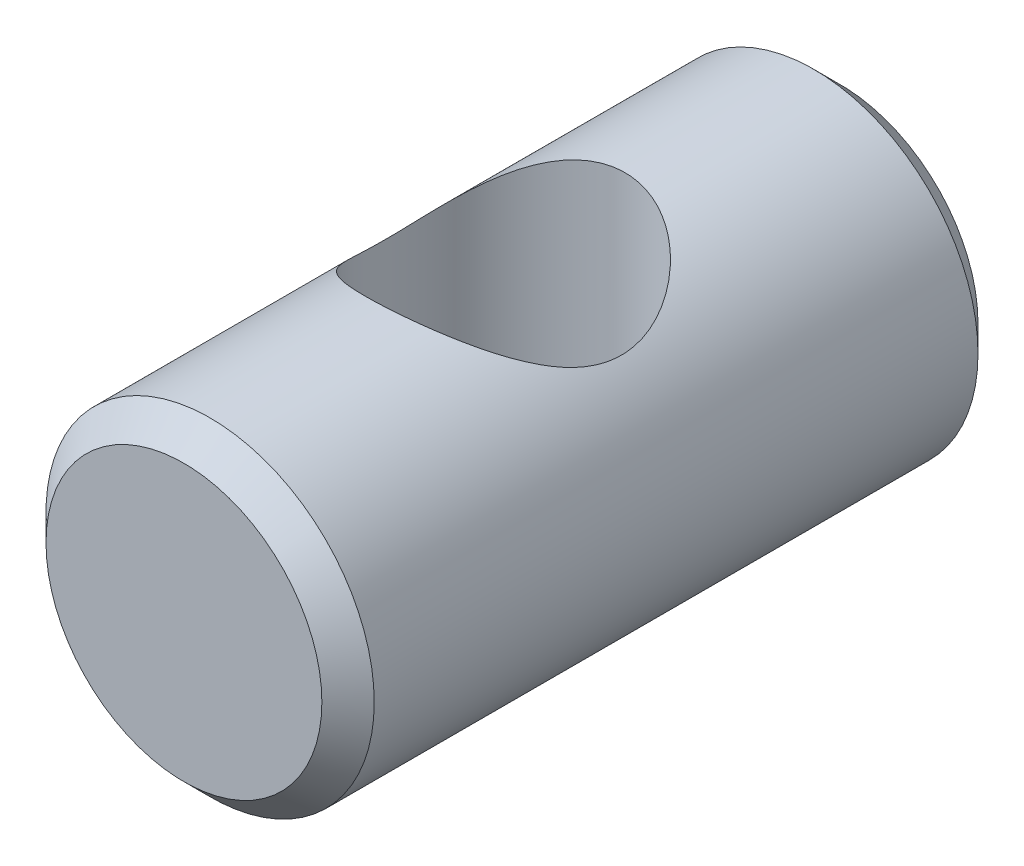
ISO-10303-21;
HEADER;
FILE_DESCRIPTION(('STEP AP214'),'2;1');
FILE_NAME('part.step','',(''),(''),'','','');
FILE_SCHEMA(('AUTOMOTIVE_DESIGN { 1 0 10303 214 1 1 1 1 }'));
ENDSEC;
DATA;
#1=APPLICATION_CONTEXT('core data for automotive mechanical design processes');
#2=APPLICATION_PROTOCOL_DEFINITION('international standard','automotive_design',2000,#1);
#3=PRODUCT_CONTEXT('',#1,'mechanical');
#4=PRODUCT('Part','Part','',(#3));
#5=PRODUCT_RELATED_PRODUCT_CATEGORY('part','',(#4));
#6=PRODUCT_DEFINITION_FORMATION('','',#4);
#7=PRODUCT_DEFINITION_CONTEXT('part definition',#1,'design');
#8=PRODUCT_DEFINITION('design','',#6,#7);
#9=PRODUCT_DEFINITION_SHAPE('','',#8);
#10=(LENGTH_UNIT() NAMED_UNIT(*) SI_UNIT(.MILLI.,.METRE.));
#11=(NAMED_UNIT(*) PLANE_ANGLE_UNIT() SI_UNIT($,.RADIAN.));
#12=(NAMED_UNIT(*) SI_UNIT($,.STERADIAN.) SOLID_ANGLE_UNIT());
#13=UNCERTAINTY_MEASURE_WITH_UNIT(LENGTH_MEASURE(1.E-05),#10,'distance_accuracy_value','');
#14=(GEOMETRIC_REPRESENTATION_CONTEXT(3) GLOBAL_UNCERTAINTY_ASSIGNED_CONTEXT((#13)) GLOBAL_UNIT_ASSIGNED_CONTEXT((#10,
#11,#12)) REPRESENTATION_CONTEXT('',''));
#15=CARTESIAN_POINT('',(0.,0.,0.));
#16=DIRECTION('',(0.,0.,1.));
#17=DIRECTION('',(1.,0.,0.));
#18=AXIS2_PLACEMENT_3D('',#15,#16,#17);
#19=CARTESIAN_POINT('',(0.,0.,9.525));
#20=DIRECTION('',(0.,0.,-1.));
#21=DIRECTION('',(-1.,0.,0.));
#22=AXIS2_PLACEMENT_3D('',#19,#20,#21);
#23=CYLINDRICAL_SURFACE('',#22,4.765);
#24=CARTESIAN_POINT('',(0.,0.,-8.76499999999998));
#25=DIRECTION('',(0.,0.,1.));
#26=DIRECTION('',(1.,0.,0.));
#27=AXIS2_PLACEMENT_3D('',#24,#25,#26);
#28=CIRCLE('',#27,4.765);
#29=CARTESIAN_POINT('',(4.765,0.,-8.76499999999998));
#30=VERTEX_POINT('',#29);
#31=EDGE_CURVE('E53',#30,#30,#28,.T.);
#32=ORIENTED_EDGE('',*,*,#31,.T.);
#33=EDGE_LOOP('',(#32));
#34=FACE_BOUND('',#33,.T.);
#35=CARTESIAN_POINT('',(0.,0.,8.76500000000001));
#36=DIRECTION('',(0.,0.,1.));
#37=DIRECTION('',(1.,0.,0.));
#38=AXIS2_PLACEMENT_3D('',#35,#36,#37);
#39=CIRCLE('',#38,4.765);
#40=CARTESIAN_POINT('',(4.765,0.,8.76500000000001));
#41=VERTEX_POINT('',#40);
#42=EDGE_CURVE('E57',#41,#41,#39,.F.);
#43=ORIENTED_EDGE('',*,*,#42,.T.);
#44=EDGE_LOOP('',(#43));
#45=FACE_BOUND('',#44,.T.);
#46=CARTESIAN_POINT('',(0.,-4.765,-3.42087708051605));
#47=CARTESIAN_POINT('',(-0.0833627581168181,-4.7649997101109,-3.42696899134863));
#48=CARTESIAN_POINT('',(-0.166953392424251,-4.76280757869707,-3.43001003086424));
#49=CARTESIAN_POINT('',(-0.333933182408652,-4.75402028790231,-3.4299899120654));
#50=CARTESIAN_POINT('',(-0.41732223719261,-4.74742325494959,-3.42692615604904));
#51=CARTESIAN_POINT('',(-0.583312250165056,-4.72989865727235,-3.41478160746824));
#52=CARTESIAN_POINT('',(-0.665912068503747,-4.71896558414041,-3.40569315136156));
#53=CARTESIAN_POINT('',(-0.829610597514772,-4.69295834085159,-3.38168739143667));
#54=CARTESIAN_POINT('',(-0.91070865358331,-4.67788240819801,-3.36676760565251));
#55=CARTESIAN_POINT('',(-1.15000632689336,-4.62699847385246,-3.31382161536754));
#56=CARTESIAN_POINT('',(-1.30524951697123,-4.58542013528299,-3.26752778272676));
#57=CARTESIAN_POINT('',(-1.60411463212557,-4.48962808746058,-3.15544383432779));
#58=CARTESIAN_POINT('',(-1.74773682156028,-4.43541466574349,-3.08965416222603));
#59=CARTESIAN_POINT('',(-2.03259497643689,-4.31273538578719,-2.93522566350036));
#60=CARTESIAN_POINT('',(-2.17272279857911,-4.24347672491827,-2.84518090003159));
#61=CARTESIAN_POINT('',(-2.43631552731587,-4.09784606286129,-2.64803347355049));
#62=CARTESIAN_POINT('',(-2.55976291960052,-4.02146672501527,-2.54091313456509));
#63=CARTESIAN_POINT('',(-2.81327393100644,-3.84950291536883,-2.28757037498761));
#64=CARTESIAN_POINT('',(-2.93940806717613,-3.75321839663728,-2.13784494064544));
#65=CARTESIAN_POINT('',(-3.10885207016274,-3.61188607024724,-1.89774924473951));
#66=CARTESIAN_POINT('',(-3.16205944901992,-3.56527135977744,-1.81509327318893));
#67=CARTESIAN_POINT('',(-3.26165283895997,-3.47438917550769,-1.64456461914389));
#68=CARTESIAN_POINT('',(-3.30804141803447,-3.43012082209569,-1.55669391813204));
#69=CARTESIAN_POINT('',(-3.41144333221737,-3.32784018306176,-1.33801732923479));
#70=CARTESIAN_POINT('',(-3.46485738281701,-3.27176419567389,-1.20454764001565));
#71=CARTESIAN_POINT('',(-3.55539465585279,-3.1731532714438,-0.92756721927326));
#72=CARTESIAN_POINT('',(-3.59255605597934,-3.13058666617785,-0.784080947165173));
#73=CARTESIAN_POINT('',(-3.64343651296181,-3.07113542283653,-0.514646140223209));
#74=CARTESIAN_POINT('',(-3.66010628533956,-3.05107413064414,-0.389980532152303));
#75=CARTESIAN_POINT('',(-3.67954153570878,-3.02761567970702,-0.13805144197163));
#76=CARTESIAN_POINT('',(-3.68232117171679,-3.02420155283186,-0.0107907379518655));
#77=CARTESIAN_POINT('',(-3.67376621747767,-3.03458366659267,0.242449329866106));
#78=CARTESIAN_POINT('',(-3.66243797397314,-3.04837216824954,0.368429244158408));
#79=CARTESIAN_POINT('',(-3.62657095184853,-3.09094772918142,0.615927376424316));
#80=CARTESIAN_POINT('',(-3.60201250089043,-3.11975712134959,0.737438661719832));
#81=CARTESIAN_POINT('',(-3.52797021750045,-3.20358122773375,1.02486117239319));
#82=CARTESIAN_POINT('',(-3.47231020523667,-3.26453704351351,1.18741075414518));
#83=CARTESIAN_POINT('',(-3.34017866781708,-3.39961296516166,1.498121783823));
#84=CARTESIAN_POINT('',(-3.2636446149314,-3.47377238661047,1.64623815847782));
#85=CARTESIAN_POINT('',(-3.12200897105521,-3.60054284241464,1.87825971607124));
#86=CARTESIAN_POINT('',(-3.06234750531042,-3.65156363596669,1.9664324955114));
#87=CARTESIAN_POINT('',(-2.93536296354977,-3.75440484501345,2.13658829521524));
#88=CARTESIAN_POINT('',(-2.86803758566651,-3.80622549668558,2.21856944344932));
#89=CARTESIAN_POINT('',(-2.65493557738645,-3.96070606463684,2.4548169203279));
#90=CARTESIAN_POINT('',(-2.4978237985218,-4.06258137631192,2.59972905493882));
#91=CARTESIAN_POINT('',(-2.18575837138569,-4.23718725327564,2.83706621766583));
#92=CARTESIAN_POINT('',(-2.03548298499758,-4.31186637762032,2.93424360521689));
#93=CARTESIAN_POINT('',(-1.71702572980925,-4.44824656330391,3.10568912436018));
#94=CARTESIAN_POINT('',(-1.54887024912961,-4.50996636079323,3.17999040299218));
#95=CARTESIAN_POINT('',(-1.22389848309853,-4.60778480850806,3.29263516387729));
#96=CARTESIAN_POINT('',(-1.06910753325384,-4.64632732736096,3.33468022800881));
#97=CARTESIAN_POINT('',(-0.752190984217971,-4.70801774696666,3.39687013419293));
#98=CARTESIAN_POINT('',(-0.590069112764688,-4.73117337991453,3.4170259792185));
#99=CARTESIAN_POINT('',(-0.262598143568304,-4.7606051003247,3.43390286080124));
#100=CARTESIAN_POINT('',(-0.0972412962651654,-4.76683385814853,3.43055828056669));
#101=CARTESIAN_POINT('',(0.231024129353291,-4.76222706928004,3.40010195996678));
#102=CARTESIAN_POINT('',(0.393932420256084,-4.75138953488968,3.37298745129903));
#103=CARTESIAN_POINT('',(0.705514268669747,-4.71498049061455,3.2979508357131));
#104=CARTESIAN_POINT('',(0.854498752183593,-4.69006694126301,3.25098003249397));
#105=CARTESIAN_POINT('',(1.14256413370517,-4.62833634686259,3.13840780618742));
#106=CARTESIAN_POINT('',(1.28164310390504,-4.59151699239254,3.07280276883643));
#107=CARTESIAN_POINT('',(1.5605913242394,-4.50478911028579,2.91796402171938));
#108=CARTESIAN_POINT('',(1.6992420339739,-4.45396042558585,2.82706121692328));
#109=CARTESIAN_POINT('',(1.96045324775841,-4.34533105232054,2.62789389216064));
#110=CARTESIAN_POINT('',(2.08299871660834,-4.28752394420402,2.51961335554432));
#111=CARTESIAN_POINT('',(2.33061071233595,-4.15886196775128,2.26753986981794));
#112=CARTESIAN_POINT('',(2.45245602746959,-4.08747815085455,2.12084350362776));
#113=CARTESIAN_POINT('',(2.67091966387116,-3.94818744226299,1.80818256348861));
#114=CARTESIAN_POINT('',(2.76753692468301,-3.88028069682256,1.64221717999394));
#115=CARTESIAN_POINT('',(2.91829752704228,-3.76775877390235,1.32363316444147));
#116=CARTESIAN_POINT('',(2.97693831230802,-3.72114907301219,1.17388770573105));
#117=CARTESIAN_POINT('',(3.04915600293589,-3.66180847873486,0.941826581338293));
#118=CARTESIAN_POINT('',(3.0706008978109,-3.64379412637323,0.863255129060434));
#119=CARTESIAN_POINT('',(3.10797188341904,-3.61197174564401,0.703992654043788));
#120=CARTESIAN_POINT('',(3.12390068817333,-3.59816164910817,0.623302694735672));
#121=CARTESIAN_POINT('',(3.15010468685879,-3.57524455910332,0.459495462666018));
#122=CARTESIAN_POINT('',(3.16032158062367,-3.5661861203942,0.376361962516616));
#123=CARTESIAN_POINT('',(3.17464168800661,-3.55344451616001,0.209195138832912));
#124=CARTESIAN_POINT('',(3.17874788699032,-3.54975872585817,0.125162274904956));
#125=CARTESIAN_POINT('',(3.18076053743013,-3.54795587812489,-0.0430393452037649));
#126=CARTESIAN_POINT('',(3.17866722999484,-3.54983860412504,-0.127208095972433));
#127=CARTESIAN_POINT('',(3.16833758034576,-3.55905933774995,-0.294840628996076));
#128=CARTESIAN_POINT('',(3.16010150131517,-3.56639711165655,-0.378304441298765));
#129=CARTESIAN_POINT('',(3.129430196119,-3.59341005189328,-0.604314657609784));
#130=CARTESIAN_POINT('',(3.10101793603989,-3.61818171011667,-0.745494317394035));
#131=CARTESIAN_POINT('',(3.02771937958645,-3.67972750014127,-1.02069983126741));
#132=CARTESIAN_POINT('',(2.98281650470617,-3.71651370639189,-1.1547183301723));
#133=CARTESIAN_POINT('',(2.8560768918245,-3.8153502491925,-1.46853642894096));
#134=CARTESIAN_POINT('',(2.76664814536404,-3.88152734494911,-1.64398166227299));
#135=CARTESIAN_POINT('',(2.56077346334119,-4.02033820070584,-1.97551522842484));
#136=CARTESIAN_POINT('',(2.44428083509274,-4.09298298410994,-2.13156938380249));
#137=CARTESIAN_POINT('',(2.18450650401399,-4.2373970566927,-2.42421216807333));
#138=CARTESIAN_POINT('',(2.04090097393914,-4.30914323590253,-2.56052605726515));
#139=CARTESIAN_POINT('',(1.72973058522059,-4.44318432752426,-2.80802181758102));
#140=CARTESIAN_POINT('',(1.56219804304704,-4.50549175797245,-2.91923707314102));
#141=CARTESIAN_POINT('',(1.23969583506405,-4.60338031575656,-3.09396462152008));
#142=CARTESIAN_POINT('',(1.08834922542924,-4.64178783933997,-3.16252149709775));
#143=CARTESIAN_POINT('',(0.85338781071092,-4.68864069192958,-3.24875451241662));
#144=CARTESIAN_POINT('',(0.773800863355168,-4.70245945854321,-3.27471971164357));
#145=CARTESIAN_POINT('',(0.612411306870997,-4.72618391319332,-3.32087000112459));
#146=CARTESIAN_POINT('',(0.530609679466058,-4.73609130567107,-3.34105760799584));
#147=CARTESIAN_POINT('',(0.374335243630177,-4.75084997254152,-3.37353939001354));
#148=CARTESIAN_POINT('',(0.300030947704158,-4.75613339853629,-3.38645258471521));
#149=CARTESIAN_POINT('',(0.150546671086999,-4.76320900575073,-3.40736829831093));
#150=CARTESIAN_POINT('',(0.0753664637160969,-4.76500026208246,-3.41536951590209));
#151=CARTESIAN_POINT('',(0.,-4.765,-3.42087708051605));
#152=B_SPLINE_CURVE_WITH_KNOTS('',3,(#46,#47,#48,#49,#50,#51,#52,#53,#54,#55,#56,#57,#58,#59,
#60,#61,#62,#63,#64,#65,#66,#67,#68,#69,#70,#71,#72,#73,#74,#75,#76,#77,#78,#79,#80,#81,#82,#83,
#84,#85,#86,#87,#88,#89,#90,#91,#92,#93,#94,#95,#96,#97,#98,#99,#100,#101,#102,#103,#104,#105,
#106,#107,#108,#109,#110,#111,#112,#113,#114,#115,#116,#117,#118,#119,#120,#121,#122,#123,#124,
#125,#126,#127,#128,#129,#130,#131,#132,#133,#134,#135,#136,#137,#138,#139,#140,#141,#142,#143,
#144,#145,#146,#147,#148,#149,#150,#151),.UNSPECIFIED.,.T.,.F.,(4,2,2,2,2,2,2,2,2,2,2,2,2,2,2,2,
2,2,2,2,2,2,2,2,2,2,2,2,2,2,2,2,2,2,2,2,2,2,2,2,2,2,2,2,2,2,2,2,2,2,2,2,4),(0.,
0.250678148817341,0.501462988541287,0.752567445437252,1.00377889552888,1.50309474088369,
2.00239922444642,2.54160992918404,3.08138247258981,3.73300244855075,4.05909733145616,
4.38506908912952,4.84654436743379,5.30692973453839,5.68734604359481,6.06737452056514,
6.44723209503533,6.82765605484285,7.37157480546313,7.91714109472133,8.27090631470675,
8.62477807035776,9.33119791439566,9.91077027397039,10.4894988486046,10.9822712500665,
11.4747958366297,11.9686961727678,12.4626540373564,12.9352342359093,13.4079061579591,
13.9261848288361,14.4449439577642,15.0533142145202,15.6617100398796,16.1619385675779,
16.4119146790501,16.6617676221917,16.9141262556176,17.1663615593023,17.4185870532858,
17.6708017414467,18.1072101440206,18.5440584873629,19.1640002904501,19.7850197135797,
20.4139885307568,21.0421157411608,21.5513660687497,21.8056438515067,22.059810706191,
22.2863833912941,22.5130160751694),.UNSPECIFIED.);
#153=CARTESIAN_POINT('',(0.,-4.765,-3.42087708051605));
#154=VERTEX_POINT('',#153);
#155=EDGE_CURVE('E62',#154,#154,#152,.T.);
#156=ORIENTED_EDGE('',*,*,#155,.T.);
#157=EDGE_LOOP('',(#156));
#158=FACE_BOUND('',#157,.T.);
#159=CARTESIAN_POINT('',(-0.25,4.75843724346555,3.43));
#160=CARTESIAN_POINT('',(-0.422180009069406,4.749390618167,3.42999980483541));
#161=CARTESIAN_POINT('',(-0.59386282730199,4.73091871113112,3.41695856293195));
#162=CARTESIAN_POINT('',(-0.930629104770302,4.67635636796384,3.36610979440147));
#163=CARTESIAN_POINT('',(-1.09570851357914,4.64025529237457,3.32828730721862));
#164=CARTESIAN_POINT('',(-1.41392411864396,4.55336447971862,3.23075051942857));
#165=CARTESIAN_POINT('',(-1.56712334101048,4.5026601113221,3.17116292636266));
#166=CARTESIAN_POINT('',(-1.85998836726663,4.38979766700268,3.03299834240104));
#167=CARTESIAN_POINT('',(-1.99965414606241,4.32763956984278,2.95442131629586));
#168=CARTESIAN_POINT('',(-2.27820698899914,4.18828982189439,2.77162910883962));
#169=CARTESIAN_POINT('',(-2.41542819149111,4.11020218068904,2.66557505303866));
#170=CARTESIAN_POINT('',(-2.67111072919315,3.94883137284482,2.43572487373919));
#171=CARTESIAN_POINT('',(-2.78953546002451,3.86553849846079,2.31189500490524));
#172=CARTESIAN_POINT('',(-2.96344629098398,3.732292646302,2.10063521621267));
#173=CARTESIAN_POINT('',(-3.02522112465854,3.68226630299909,2.01833701427756));
#174=CARTESIAN_POINT('',(-3.14150590868554,3.58357003530251,1.84790207991889));
#175=CARTESIAN_POINT('',(-3.1960131207988,3.5349006275963,1.7597631654945));
#176=CARTESIAN_POINT('',(-3.29731229261899,3.44060115304685,1.57784833521895));
#177=CARTESIAN_POINT('',(-3.34411822611588,3.39496567295495,1.48408305992192));
#178=CARTESIAN_POINT('',(-3.42959137880208,3.30859742398812,1.29083456033672));
#179=CARTESIAN_POINT('',(-3.46826509160405,3.2678607546062,1.19135597958454));
#180=CARTESIAN_POINT('',(-3.54347659526858,3.18632211811376,0.966712328692861));
#181=CARTESIAN_POINT('',(-3.57812346664731,3.14705996480953,0.840323998552468));
#182=CARTESIAN_POINT('',(-3.63302442402354,3.08352956814293,0.580976208361932));
#183=CARTESIAN_POINT('',(-3.65331272726122,3.05922569654856,0.448033183521057));
#184=CARTESIAN_POINT('',(-3.67812283683354,3.02936636632518,0.177337549423231));
#185=CARTESIAN_POINT('',(-3.68251233934075,3.02396824643502,0.0395541719109347));
#186=CARTESIAN_POINT('',(-3.67470644643728,3.03344305810687,-0.234875874606968));
#187=CARTESIAN_POINT('',(-3.66249943392474,3.04833018879986,-0.37152167996018));
#188=CARTESIAN_POINT('',(-3.62015799382368,3.09852315491188,-0.655828380639309));
#189=CARTESIAN_POINT('',(-3.58799174144691,3.13612809889826,-0.802759414360211));
#190=CARTESIAN_POINT('',(-3.50660899556505,3.22685391573891,-1.08690765852793));
#191=CARTESIAN_POINT('',(-3.45734815065714,3.28001509196861,-1.22409847190397));
#192=CARTESIAN_POINT('',(-3.35999029035731,3.37921222953507,-1.45031682658415));
#193=CARTESIAN_POINT('',(-3.31552748835515,3.42299124550292,-1.54196683547208));
#194=CARTESIAN_POINT('',(-3.21937168211258,3.51357799533849,-1.7198719105116));
#195=CARTESIAN_POINT('',(-3.16767569861283,3.56038697291961,-1.80612473233373));
#196=CARTESIAN_POINT('',(-3.05733519065029,3.655577234441,-1.97327341136436));
#197=CARTESIAN_POINT('',(-2.99868376029761,3.70396004583247,-2.05416381804875));
#198=CARTESIAN_POINT('',(-2.87465956601933,3.80102084509467,-2.21043246978884));
#199=CARTESIAN_POINT('',(-2.80928649472037,3.84969884636825,-2.28581046249783));
#200=CARTESIAN_POINT('',(-2.6702557671566,3.94744940552613,-2.43263894546763));
#201=CARTESIAN_POINT('',(-2.59643405525365,3.99650228404323,-2.50394748039488));
#202=CARTESIAN_POINT('',(-2.44198609531555,4.09270177982323,-2.64020867362414));
#203=CARTESIAN_POINT('',(-2.36135999487914,4.13984843840247,-2.70516146972696));
#204=CARTESIAN_POINT('',(-2.19361254846785,4.2311207520192,-2.82808330517596));
#205=CARTESIAN_POINT('',(-2.10650409604225,4.27525208591359,-2.88606563800173));
#206=CARTESIAN_POINT('',(-1.92594548966524,4.3595756679867,-2.99452956360935));
#207=CARTESIAN_POINT('',(-1.8324951446076,4.39976779737236,-3.04501093021117));
#208=CARTESIAN_POINT('',(-1.58991791011193,4.49465680101692,-3.16160717844564));
#209=CARTESIAN_POINT('',(-1.43688887677842,4.54617300319559,-3.22239703143537));
#210=CARTESIAN_POINT('',(-1.11985321098478,4.63445714602499,-3.3220213557935));
#211=CARTESIAN_POINT('',(-0.955854490731875,4.67123558567514,-3.36087146486794));
#212=CARTESIAN_POINT('',(-0.620041304864638,4.72756501903715,-3.41423360193657));
#213=CARTESIAN_POINT('',(-0.448189976813925,4.74702354164412,-3.42861536060857));
#214=CARTESIAN_POINT('',(-0.10319553205656,4.76701209164517,-3.43119218349009));
#215=CARTESIAN_POINT('',(0.069947271391446,4.76754656888776,-3.41939340455174));
#216=CARTESIAN_POINT('',(0.396800733953032,4.75102741592386,-3.37216085402572));
#217=CARTESIAN_POINT('',(0.550903795546911,4.73547935394817,-3.33884247322146));
#218=CARTESIAN_POINT('',(0.851262679297079,4.69080460019725,-3.25216372524372));
#219=CARTESIAN_POINT('',(0.997516834516369,4.66167503663273,-3.19879911978834));
#220=CARTESIAN_POINT('',(1.28614476637547,4.59066745677348,-3.07104032256261));
#221=CARTESIAN_POINT('',(1.42797966766526,4.5482360225696,-2.99574591149817));
#222=CARTESIAN_POINT('',(1.69771873358212,4.45459184021555,-2.82781924377908));
#223=CARTESIAN_POINT('',(1.82561916137349,4.40337674596602,-2.73518235437366));
#224=CARTESIAN_POINT('',(2.08559098582612,4.28706511495821,-2.51852707855975));
#225=CARTESIAN_POINT('',(2.2150420244168,4.22105957781513,-2.39185853378127));
#226=CARTESIAN_POINT('',(2.4525288591269,4.08765163666692,-2.119882962336));
#227=CARTESIAN_POINT('',(2.56051870491994,4.02024656957631,-1.97453701758847));
#228=CARTESIAN_POINT('',(2.71141297716131,3.91890470250436,-1.73364032653499));
#229=CARTESIAN_POINT('',(2.76225962831151,3.88310759046258,-1.64375989611527));
#230=CARTESIAN_POINT('',(2.85606768069206,3.81463871939836,-1.45876664530863));
#231=CARTESIAN_POINT('',(2.8990272649147,3.78196768138303,-1.36365262576039));
#232=CARTESIAN_POINT('',(2.97638382467227,3.7213945324715,-1.16888238761678));
#233=CARTESIAN_POINT('',(3.01080676435227,3.6934780438477,-1.06924106056856));
#234=CARTESIAN_POINT('',(3.07061216797024,3.64390866973889,-0.865836413850732));
#235=CARTESIAN_POINT('',(3.09600079900905,3.62225151334222,-0.762075960014793));
#236=CARTESIAN_POINT('',(3.14431905107756,3.58048576732931,-0.51427610984992));
#237=CARTESIAN_POINT('',(3.1632690781055,3.56357947310397,-0.36886387726438));
#238=CARTESIAN_POINT('',(3.18229415057448,3.54660528363273,-0.0759553160984843));
#239=CARTESIAN_POINT('',(3.18238833621043,3.54652031339164,0.0715387471135818));
#240=CARTESIAN_POINT('',(3.16376347579515,3.56313911837427,0.36412784346974));
#241=CARTESIAN_POINT('',(3.14506985693007,3.57982020262542,0.509225849632981));
#242=CARTESIAN_POINT('',(3.09006178812863,3.6274007096972,0.793694678976364));
#243=CARTESIAN_POINT('',(3.05372153995533,3.65832094581284,0.933056792070445));
#244=CARTESIAN_POINT('',(2.94995679839854,3.74283457822027,1.249627259653));
#245=CARTESIAN_POINT('',(2.87616913174531,3.80056128592335,1.42363336901504));
#246=CARTESIAN_POINT('',(2.70309172031867,3.9255469405295,1.75476054116614));
#247=CARTESIAN_POINT('',(2.60375916203549,3.99282180458683,1.91185262262683));
#248=CARTESIAN_POINT('',(2.37965965281677,4.13038218124549,2.21024978907531));
#249=CARTESIAN_POINT('',(2.25446848393284,4.20070005001654,2.35122119961121));
#250=CARTESIAN_POINT('',(1.98132226028618,4.33621841215064,2.61183089931648));
#251=CARTESIAN_POINT('',(1.83339056066265,4.40142405331531,2.73149080683867));
#252=CARTESIAN_POINT('',(1.53413492006617,4.51378899534322,2.93439863762912));
#253=CARTESIAN_POINT('',(1.38501302638156,4.56214832085995,3.02021473285691));
#254=CARTESIAN_POINT('',(1.07249564524745,4.64554146755817,3.16951406225263));
#255=CARTESIAN_POINT('',(0.909111289256103,4.68058556855773,3.23301452201411));
#256=CARTESIAN_POINT('',(0.581478494873657,4.73212589223905,3.33183530764178));
#257=CARTESIAN_POINT('',(0.417802064196769,4.74955942472212,3.36854686433097));
#258=CARTESIAN_POINT('',(0.0859254534274418,4.76711849433294,3.41762518536938));
#259=CARTESIAN_POINT('',(-0.0822731758795955,4.76724989098796,3.43000019011695));
#260=CARTESIAN_POINT('',(-0.25,4.75843724346555,3.43));
#261=B_SPLINE_CURVE_WITH_KNOTS('',3,(#159,#160,#161,#162,#163,#164,#165,#166,#167,#168,#169,
#170,#171,#172,#173,#174,#175,#176,#177,#178,#179,#180,#181,#182,#183,#184,#185,#186,#187,#188,
#189,#190,#191,#192,#193,#194,#195,#196,#197,#198,#199,#200,#201,#202,#203,#204,#205,#206,#207,
#208,#209,#210,#211,#212,#213,#214,#215,#216,#217,#218,#219,#220,#221,#222,#223,#224,#225,#226,
#227,#228,#229,#230,#231,#232,#233,#234,#235,#236,#237,#238,#239,#240,#241,#242,#243,#244,#245,
#246,#247,#248,#249,#250,#251,#252,#253,#254,#255,#256,#257,#258,#259,#260),.UNSPECIFIED.,.T.,
.F.,(4,2,2,2,2,2,2,2,2,2,2,2,2,2,2,2,2,2,2,2,2,2,2,2,2,2,2,2,2,2,2,2,2,2,2,2,2,2,2,2,2,2,2,2,2,
2,2,2,2,2,4),(0.,0.516551025096824,1.03341418220019,1.54731512007828,2.06121701081903,
2.62982932183038,3.19953571462131,3.54246459279583,3.88552231417978,4.22795053195655,
4.57010427222594,4.97905439316964,5.38702665221778,5.79838620186915,6.21003384012951,
6.67262967068467,7.1364347778277,7.46866532411958,7.80103311718076,8.13373371721725,
8.46644953806418,8.80733809568013,9.14821926074384,9.48843965067855,9.82867029735156,
10.3440014803113,10.8589648922706,11.3766614843259,11.8942363430695,12.3673901670618,
12.8406440841658,13.3370245096255,13.8335377244494,14.4096746680997,14.9870321881218,
15.3145391492316,15.6421214663625,15.968694875667,16.2950449261748,16.7357599059526,
17.1760275223247,17.6157000871626,18.0560173690192,18.6457302885718,19.2364380888803,
19.8377403374759,20.4384291081866,20.9723943239786,21.5059464582794,22.0093081125728,
22.5124992983782),.UNSPECIFIED.);
#262=CARTESIAN_POINT('',(-0.25,4.75843724346555,3.43));
#263=VERTEX_POINT('',#262);
#264=EDGE_CURVE('E70',#263,#263,#261,.T.);
#265=ORIENTED_EDGE('',*,*,#264,.T.);
#266=EDGE_LOOP('',(#265));
#267=FACE_BOUND('',#266,.T.);
#268=ADVANCED_FACE('F41',(#34,#45,#158,#267),#23,.T.);
#269=CARTESIAN_POINT('',(0.,0.,9.525));
#270=DIRECTION('',(0.,0.,1.));
#271=DIRECTION('',(1.,0.,0.));
#272=AXIS2_PLACEMENT_3D('',#269,#270,#271);
#273=PLANE('',#272);
#274=CARTESIAN_POINT('',(0.,0.,9.525));
#275=DIRECTION('',(0.,0.,1.));
#276=DIRECTION('',(1.,0.,0.));
#277=AXIS2_PLACEMENT_3D('',#274,#275,#276);
#278=CIRCLE('',#277,4.00500000000001);
#279=CARTESIAN_POINT('',(4.00500000000001,0.,9.525));
#280=VERTEX_POINT('',#279);
#281=EDGE_CURVE('E10',#280,#280,#278,.T.);
#282=ORIENTED_EDGE('',*,*,#281,.T.);
#283=EDGE_LOOP('',(#282));
#284=FACE_BOUND('',#283,.T.);
#285=ADVANCED_FACE('F83',(#284),#273,.T.);
#286=CARTESIAN_POINT('',(0.,0.,-9.525));
#287=DIRECTION('',(0.,0.,1.));
#288=DIRECTION('',(1.,0.,0.));
#289=AXIS2_PLACEMENT_3D('',#286,#287,#288);
#290=PLANE('',#289);
#291=CARTESIAN_POINT('',(0.,0.,-9.525));
#292=DIRECTION('',(0.,0.,1.));
#293=DIRECTION('',(1.,0.,0.));
#294=AXIS2_PLACEMENT_3D('',#291,#292,#293);
#295=CIRCLE('',#294,4.00499999999998);
#296=CARTESIAN_POINT('',(4.00499999999998,0.,-9.525));
#297=VERTEX_POINT('',#296);
#298=EDGE_CURVE('E49',#297,#297,#295,.F.);
#299=ORIENTED_EDGE('',*,*,#298,.T.);
#300=EDGE_LOOP('',(#299));
#301=FACE_BOUND('',#300,.T.);
#302=ADVANCED_FACE('F81',(#301),#290,.F.);
#303=CARTESIAN_POINT('',(-0.25,-4.765,0.));
#304=DIRECTION('',(0.,1.,0.));
#305=DIRECTION('',(0.,0.,1.));
#306=AXIS2_PLACEMENT_3D('',#303,#304,#305);
#307=CYLINDRICAL_SURFACE('',#306,3.43);
#308=ORIENTED_EDGE('',*,*,#264,.F.);
#309=EDGE_LOOP('',(#308));
#310=FACE_BOUND('',#309,.T.);
#311=ORIENTED_EDGE('',*,*,#155,.F.);
#312=EDGE_LOOP('',(#311));
#313=FACE_BOUND('',#312,.T.);
#314=ADVANCED_FACE('F76',(#310,#313),#307,.F.);
#315=CARTESIAN_POINT('',(0.,0.,-8.76499999999998));
#316=DIRECTION('',(0.,0.,1.));
#317=DIRECTION('',(1.,0.,0.));
#318=AXIS2_PLACEMENT_3D('',#315,#316,#317);
#319=CONICAL_SURFACE('',#318,4.765,0.785398163397451);
#320=CARTESIAN_POINT('',(4.00499999999998,0.,-9.525));
#321=CARTESIAN_POINT('',(4.01291666666664,0.,-9.51708333333333));
#322=CARTESIAN_POINT('',(4.02083333333331,0.,-9.50916666666667));
#323=CARTESIAN_POINT('',(4.03666666666664,0.,-9.49333333333333));
#324=CARTESIAN_POINT('',(4.04458333333331,0.,-9.48541666666667));
#325=CARTESIAN_POINT('',(4.06041666666665,0.,-9.46958333333333));
#326=CARTESIAN_POINT('',(4.06833333333331,0.,-9.46166666666666));
#327=CARTESIAN_POINT('',(4.08416666666665,0.,-9.44583333333333));
#328=CARTESIAN_POINT('',(4.09208333333331,0.,-9.43791666666667));
#329=CARTESIAN_POINT('',(4.10791666666665,0.,-9.42208333333333));
#330=CARTESIAN_POINT('',(4.11583333333331,0.,-9.41416666666666));
#331=CARTESIAN_POINT('',(4.13166666666665,0.,-9.39833333333333));
#332=CARTESIAN_POINT('',(4.13958333333331,0.,-9.39041666666666));
#333=CARTESIAN_POINT('',(4.15541666666665,0.,-9.37458333333333));
#334=CARTESIAN_POINT('',(4.16333333333332,0.,-9.36666666666666));
#335=CARTESIAN_POINT('',(4.17916666666665,0.,-9.35083333333333));
#336=CARTESIAN_POINT('',(4.18708333333332,0.,-9.34291666666666));
#337=CARTESIAN_POINT('',(4.20291666666665,0.,-9.32708333333333));
#338=CARTESIAN_POINT('',(4.21083333333332,0.,-9.31916666666666));
#339=CARTESIAN_POINT('',(4.22666666666665,0.,-9.30333333333333));
#340=CARTESIAN_POINT('',(4.23458333333332,0.,-9.29541666666666));
#341=CARTESIAN_POINT('',(4.25041666666665,0.,-9.27958333333333));
#342=CARTESIAN_POINT('',(4.25833333333332,0.,-9.27166666666666));
#343=CARTESIAN_POINT('',(4.27416666666665,0.,-9.25583333333333));
#344=CARTESIAN_POINT('',(4.28208333333332,0.,-9.24791666666666));
#345=CARTESIAN_POINT('',(4.29791666666665,0.,-9.23208333333333));
#346=CARTESIAN_POINT('',(4.30583333333332,0.,-9.22416666666666));
#347=CARTESIAN_POINT('',(4.32166666666665,0.,-9.20833333333333));
#348=CARTESIAN_POINT('',(4.32958333333332,0.,-9.20041666666666));
#349=CARTESIAN_POINT('',(4.34541666666665,0.,-9.18458333333333));
#350=CARTESIAN_POINT('',(4.35333333333332,0.,-9.17666666666666));
#351=CARTESIAN_POINT('',(4.36916666666666,0.,-9.16083333333332));
#352=CARTESIAN_POINT('',(4.37708333333332,0.,-9.15291666666666));
#353=CARTESIAN_POINT('',(4.39291666666666,0.,-9.13708333333332));
#354=CARTESIAN_POINT('',(4.40083333333332,0.,-9.12916666666666));
#355=CARTESIAN_POINT('',(4.41666666666666,0.,-9.11333333333332));
#356=CARTESIAN_POINT('',(4.42458333333332,0.,-9.10541666666666));
#357=CARTESIAN_POINT('',(4.44041666666666,0.,-9.08958333333332));
#358=CARTESIAN_POINT('',(4.44833333333332,0.,-9.08166666666665));
#359=CARTESIAN_POINT('',(4.46416666666666,0.,-9.06583333333332));
#360=CARTESIAN_POINT('',(4.47208333333332,0.,-9.05791666666665));
#361=CARTESIAN_POINT('',(4.48791666666666,0.,-9.04208333333332));
#362=CARTESIAN_POINT('',(4.49583333333333,0.,-9.03416666666665));
#363=CARTESIAN_POINT('',(4.51166666666666,0.,-9.01833333333332));
#364=CARTESIAN_POINT('',(4.51958333333333,0.,-9.01041666666665));
#365=CARTESIAN_POINT('',(4.53541666666666,0.,-8.99458333333332));
#366=CARTESIAN_POINT('',(4.54333333333333,0.,-8.98666666666665));
#367=CARTESIAN_POINT('',(4.55916666666666,0.,-8.97083333333332));
#368=CARTESIAN_POINT('',(4.56708333333333,0.,-8.96291666666665));
#369=CARTESIAN_POINT('',(4.58291666666666,0.,-8.94708333333332));
#370=CARTESIAN_POINT('',(4.59083333333333,0.,-8.93916666666665));
#371=CARTESIAN_POINT('',(4.60666666666666,0.,-8.92333333333332));
#372=CARTESIAN_POINT('',(4.61458333333333,0.,-8.91541666666665));
#373=CARTESIAN_POINT('',(4.63041666666666,0.,-8.89958333333332));
#374=CARTESIAN_POINT('',(4.63833333333333,0.,-8.89166666666665));
#375=CARTESIAN_POINT('',(4.65416666666666,0.,-8.87583333333332));
#376=CARTESIAN_POINT('',(4.66208333333333,0.,-8.86791666666665));
#377=CARTESIAN_POINT('',(4.67791666666667,0.,-8.85208333333332));
#378=CARTESIAN_POINT('',(4.68583333333333,0.,-8.84416666666665));
#379=CARTESIAN_POINT('',(4.70166666666667,0.,-8.82833333333332));
#380=CARTESIAN_POINT('',(4.70958333333333,0.,-8.82041666666665));
#381=CARTESIAN_POINT('',(4.72541666666667,0.,-8.80458333333332));
#382=CARTESIAN_POINT('',(4.73333333333333,0.,-8.79666666666665));
#383=CARTESIAN_POINT('',(4.74916666666667,0.,-8.78083333333331));
#384=CARTESIAN_POINT('',(4.75708333333333,0.,-8.77291666666665));
#385=CARTESIAN_POINT('',(4.765,0.,-8.76499999999998));
#386=B_SPLINE_CURVE_WITH_KNOTS('',3,(#320,#321,#322,#323,#324,#325,#326,#327,#328,#329,#330,
#331,#332,#333,#334,#335,#336,#337,#338,#339,#340,#341,#342,#343,#344,#345,#346,#347,#348,#349,
#350,#351,#352,#353,#354,#355,#356,#357,#358,#359,#360,#361,#362,#363,#364,#365,#366,#367,#368,
#369,#370,#371,#372,#373,#374,#375,#376,#377,#378,#379,#380,#381,#382,#383,#384,#385),
.UNSPECIFIED.,.F.,.F.,(4,2,2,2,2,2,2,2,2,2,2,2,2,2,2,2,2,2,2,2,2,2,2,2,2,2,2,2,2,2,2,2,4),(0.,
0.0335875721063609,0.0671751442127236,0.100762716319086,0.134350288425447,0.167937860531809,
0.201525432638172,0.235113004744533,0.268700576850895,0.302288148957258,0.335875721063619,
0.369463293169981,0.403050865276344,0.436638437382705,0.470226009489067,0.503813581595429,
0.537401153701792,0.570988725808153,0.604576297914516,0.638163870020878,0.671751442127239,
0.705339014233602,0.738926586339964,0.772514158446325,0.806101730552688,0.83968930265905,
0.873276874765411,0.906864446871773,0.940452018978136,0.974039591084497,1.00762716319086,
1.04121473529722,1.07480230740358),.UNSPECIFIED.);
#387=EDGE_CURVE('BSEAM80',#297,#30,#386,.T.);
#388=ORIENTED_EDGE('',*,*,#298,.F.);
#389=ORIENTED_EDGE('',*,*,#31,.F.);
#390=ORIENTED_EDGE('',*,*,#387,.T.);
#391=ORIENTED_EDGE('',*,*,#387,.F.);
#392=EDGE_LOOP('',(#388,#390,#389,#391));
#393=FACE_BOUND('',#392,.T.);
#394=ADVANCED_FACE('F80',(#393),#319,.T.);
#395=CARTESIAN_POINT('',(0.,0.,9.525));
#396=DIRECTION('',(0.,0.,-1.));
#397=DIRECTION('',(-1.,0.,0.));
#398=AXIS2_PLACEMENT_3D('',#395,#396,#397);
#399=CONICAL_SURFACE('',#398,4.00500000000001,0.785398163397448);
#400=ORIENTED_EDGE('',*,*,#42,.F.);
#401=EDGE_LOOP('',(#400));
#402=FACE_BOUND('',#401,.T.);
#403=ORIENTED_EDGE('',*,*,#281,.F.);
#404=EDGE_LOOP('',(#403));
#405=FACE_BOUND('',#404,.T.);
#406=ADVANCED_FACE('F44',(#402,#405),#399,.T.);
#407=CLOSED_SHELL('',(#268,#285,#302,#314,#394,#406));
#408=MANIFOLD_SOLID_BREP('B2',#407);
#409=ADVANCED_BREP_SHAPE_REPRESENTATION('',(#18,#408),#14);
#410=SHAPE_DEFINITION_REPRESENTATION(#9,#409);
ENDSEC;
END-ISO-10303-21;
